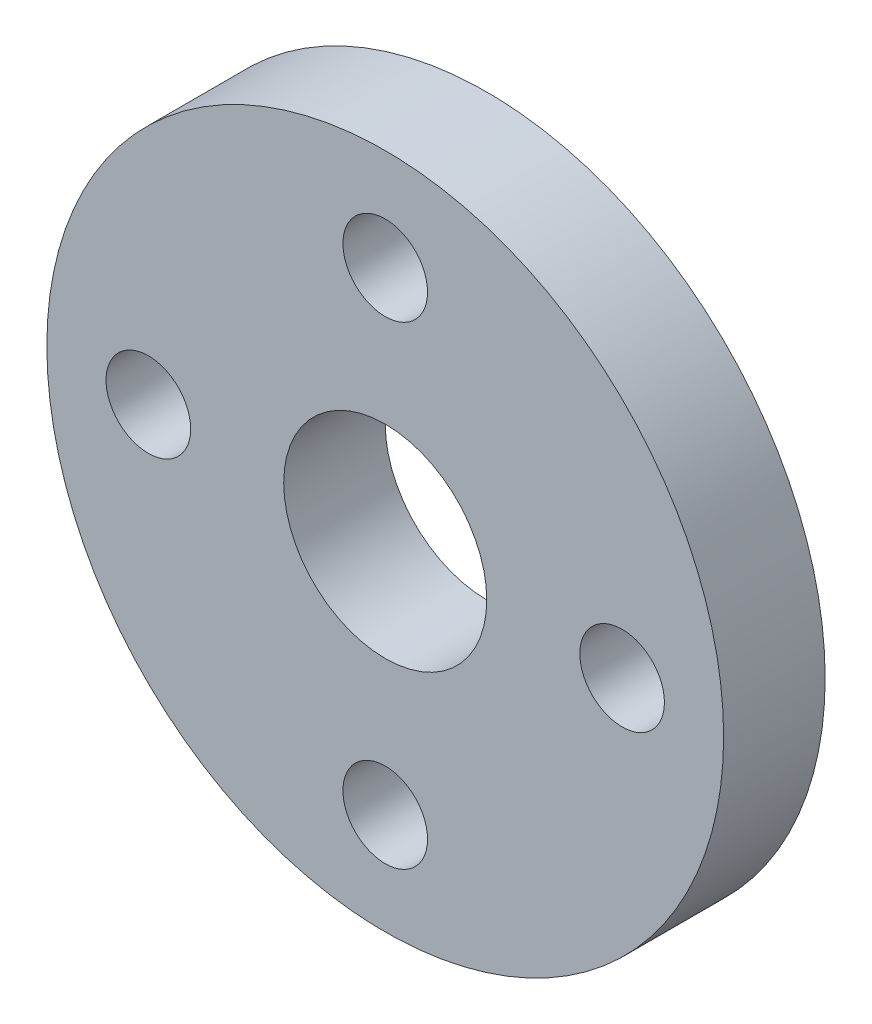
ISO-10303-21;
HEADER;
FILE_DESCRIPTION(('STEP AP214'),'2;1');
FILE_NAME('part.step','',(''),(''),'','','');
FILE_SCHEMA(('AUTOMOTIVE_DESIGN { 1 0 10303 214 1 1 1 1 }'));
ENDSEC;
DATA;
#1=APPLICATION_CONTEXT('core data for automotive mechanical design processes');
#2=APPLICATION_PROTOCOL_DEFINITION('international standard','automotive_design',2000,#1);
#3=PRODUCT_CONTEXT('',#1,'mechanical');
#4=PRODUCT('Part','Part','',(#3));
#5=PRODUCT_RELATED_PRODUCT_CATEGORY('part','',(#4));
#6=PRODUCT_DEFINITION_FORMATION('','',#4);
#7=PRODUCT_DEFINITION_CONTEXT('part definition',#1,'design');
#8=PRODUCT_DEFINITION('design','',#6,#7);
#9=PRODUCT_DEFINITION_SHAPE('','',#8);
#10=(LENGTH_UNIT() NAMED_UNIT(*) SI_UNIT(.MILLI.,.METRE.));
#11=(NAMED_UNIT(*) PLANE_ANGLE_UNIT() SI_UNIT($,.RADIAN.));
#12=(NAMED_UNIT(*) SI_UNIT($,.STERADIAN.) SOLID_ANGLE_UNIT());
#13=UNCERTAINTY_MEASURE_WITH_UNIT(LENGTH_MEASURE(1.E-05),#10,'distance_accuracy_value','');
#14=(GEOMETRIC_REPRESENTATION_CONTEXT(3) GLOBAL_UNCERTAINTY_ASSIGNED_CONTEXT((#13)) GLOBAL_UNIT_ASSIGNED_CONTEXT((#10,
#11,#12)) REPRESENTATION_CONTEXT('',''));
#15=CARTESIAN_POINT('',(0.,0.,0.));
#16=DIRECTION('',(0.,0.,1.));
#17=DIRECTION('',(1.,0.,0.));
#18=AXIS2_PLACEMENT_3D('',#15,#16,#17);
#19=CARTESIAN_POINT('',(0.,0.,3.));
#20=DIRECTION('',(0.,0.,1.));
#21=DIRECTION('',(1.,0.,0.));
#22=AXIS2_PLACEMENT_3D('',#19,#20,#21);
#23=PLANE('',#22);
#24=CARTESIAN_POINT('',(0.,7.,3.));
#25=DIRECTION('',(0.,0.,1.));
#26=DIRECTION('',(1.,0.,0.));
#27=AXIS2_PLACEMENT_3D('',#24,#25,#26);
#28=CIRCLE('',#27,1.24999999999999);
#29=CARTESIAN_POINT('',(1.24999999999999,7.,3.));
#30=VERTEX_POINT('',#29);
#31=EDGE_CURVE('E74',#30,#30,#28,.T.);
#32=ORIENTED_EDGE('',*,*,#31,.F.);
#33=EDGE_LOOP('',(#32));
#34=FACE_BOUND('',#33,.T.);
#35=CARTESIAN_POINT('',(-6.9999999999998,-1.98951966012828E-13,3.));
#36=DIRECTION('',(0.,0.,1.));
#37=DIRECTION('',(1.,0.,0.));
#38=AXIS2_PLACEMENT_3D('',#35,#36,#37);
#39=CIRCLE('',#38,1.24999999999999);
#40=CARTESIAN_POINT('',(-5.74999999999982,-1.98951966012828E-13,3.));
#41=VERTEX_POINT('',#40);
#42=EDGE_CURVE('E68',#41,#41,#39,.T.);
#43=ORIENTED_EDGE('',*,*,#42,.F.);
#44=EDGE_LOOP('',(#43));
#45=FACE_BOUND('',#44,.T.);
#46=CARTESIAN_POINT('',(3.9618942650685E-13,-7.,3.));
#47=DIRECTION('',(0.,0.,1.));
#48=DIRECTION('',(1.,0.,0.));
#49=AXIS2_PLACEMENT_3D('',#46,#47,#48);
#50=CIRCLE('',#49,1.24999999999999);
#51=CARTESIAN_POINT('',(1.25000000000038,-7.,3.));
#52=VERTEX_POINT('',#51);
#53=EDGE_CURVE('E62',#52,#52,#50,.T.);
#54=ORIENTED_EDGE('',*,*,#53,.F.);
#55=EDGE_LOOP('',(#54));
#56=FACE_BOUND('',#55,.T.);
#57=CARTESIAN_POINT('',(7.0000000000002,1.98094713253425E-13,3.));
#58=DIRECTION('',(0.,0.,1.));
#59=DIRECTION('',(1.,0.,0.));
#60=AXIS2_PLACEMENT_3D('',#57,#58,#59);
#61=CIRCLE('',#60,1.24999999999999);
#62=CARTESIAN_POINT('',(8.25000000000018,1.98094713253425E-13,3.));
#63=VERTEX_POINT('',#62);
#64=EDGE_CURVE('E56',#63,#63,#61,.T.);
#65=ORIENTED_EDGE('',*,*,#64,.F.);
#66=EDGE_LOOP('',(#65));
#67=FACE_BOUND('',#66,.T.);
#68=CARTESIAN_POINT('',(0.,0.,3.));
#69=DIRECTION('',(0.,0.,1.));
#70=DIRECTION('',(1.,0.,0.));
#71=AXIS2_PLACEMENT_3D('',#68,#69,#70);
#72=CIRCLE('',#71,10.);
#73=CARTESIAN_POINT('',(10.,0.,3.));
#74=VERTEX_POINT('',#73);
#75=EDGE_CURVE('E10',#74,#74,#72,.T.);
#76=ORIENTED_EDGE('',*,*,#75,.T.);
#77=EDGE_LOOP('',(#76));
#78=FACE_BOUND('',#77,.T.);
#79=CARTESIAN_POINT('',(0.,0.,3.));
#80=DIRECTION('',(0.,0.,1.));
#81=DIRECTION('',(1.,0.,0.));
#82=AXIS2_PLACEMENT_3D('',#79,#80,#81);
#83=CIRCLE('',#82,3.);
#84=CARTESIAN_POINT('',(3.,0.,3.));
#85=VERTEX_POINT('',#84);
#86=EDGE_CURVE('E46',#85,#85,#83,.T.);
#87=ORIENTED_EDGE('',*,*,#86,.F.);
#88=EDGE_LOOP('',(#87));
#89=FACE_BOUND('',#88,.T.);
#90=ADVANCED_FACE('F35',(#34,#45,#56,#67,#78,#89),#23,.T.);
#91=CARTESIAN_POINT('',(0.,0.,0.));
#92=DIRECTION('',(0.,0.,1.));
#93=DIRECTION('',(1.,0.,0.));
#94=AXIS2_PLACEMENT_3D('',#91,#92,#93);
#95=PLANE('',#94);
#96=CARTESIAN_POINT('',(0.,7.,0.));
#97=DIRECTION('',(0.,0.,1.));
#98=DIRECTION('',(1.,0.,0.));
#99=AXIS2_PLACEMENT_3D('',#96,#97,#98);
#100=CIRCLE('',#99,1.25);
#101=CARTESIAN_POINT('',(1.25,7.,0.));
#102=VERTEX_POINT('',#101);
#103=EDGE_CURVE('E71',#102,#102,#100,.T.);
#104=ORIENTED_EDGE('',*,*,#103,.T.);
#105=EDGE_LOOP('',(#104));
#106=FACE_BOUND('',#105,.T.);
#107=CARTESIAN_POINT('',(-6.9999999999998,-1.98951966012828E-13,0.));
#108=DIRECTION('',(0.,0.,1.));
#109=DIRECTION('',(1.,0.,0.));
#110=AXIS2_PLACEMENT_3D('',#107,#108,#109);
#111=CIRCLE('',#110,1.25);
#112=CARTESIAN_POINT('',(-5.7499999999998,-1.98951966012828E-13,0.));
#113=VERTEX_POINT('',#112);
#114=EDGE_CURVE('E65',#113,#113,#111,.T.);
#115=ORIENTED_EDGE('',*,*,#114,.T.);
#116=EDGE_LOOP('',(#115));
#117=FACE_BOUND('',#116,.T.);
#118=CARTESIAN_POINT('',(3.9618942650685E-13,-7.,0.));
#119=DIRECTION('',(0.,0.,1.));
#120=DIRECTION('',(1.,0.,0.));
#121=AXIS2_PLACEMENT_3D('',#118,#119,#120);
#122=CIRCLE('',#121,1.25);
#123=CARTESIAN_POINT('',(1.25000000000039,-7.,0.));
#124=VERTEX_POINT('',#123);
#125=EDGE_CURVE('E59',#124,#124,#122,.T.);
#126=ORIENTED_EDGE('',*,*,#125,.T.);
#127=EDGE_LOOP('',(#126));
#128=FACE_BOUND('',#127,.T.);
#129=CARTESIAN_POINT('',(7.0000000000002,1.98094713253425E-13,0.));
#130=DIRECTION('',(0.,0.,1.));
#131=DIRECTION('',(1.,0.,0.));
#132=AXIS2_PLACEMENT_3D('',#129,#130,#131);
#133=CIRCLE('',#132,1.25);
#134=CARTESIAN_POINT('',(8.2500000000002,1.98094713253425E-13,0.));
#135=VERTEX_POINT('',#134);
#136=EDGE_CURVE('E51',#135,#135,#133,.T.);
#137=ORIENTED_EDGE('',*,*,#136,.T.);
#138=EDGE_LOOP('',(#137));
#139=FACE_BOUND('',#138,.T.);
#140=CARTESIAN_POINT('',(0.,0.,0.));
#141=DIRECTION('',(0.,0.,1.));
#142=DIRECTION('',(1.,0.,0.));
#143=AXIS2_PLACEMENT_3D('',#140,#141,#142);
#144=CIRCLE('',#143,10.);
#145=CARTESIAN_POINT('',(10.,0.,0.));
#146=VERTEX_POINT('',#145);
#147=EDGE_CURVE('E39',#146,#146,#144,.T.);
#148=ORIENTED_EDGE('',*,*,#147,.F.);
#149=EDGE_LOOP('',(#148));
#150=FACE_BOUND('',#149,.T.);
#151=CARTESIAN_POINT('',(0.,0.,0.));
#152=DIRECTION('',(0.,0.,1.));
#153=DIRECTION('',(1.,0.,0.));
#154=AXIS2_PLACEMENT_3D('',#151,#152,#153);
#155=CIRCLE('',#154,3.);
#156=CARTESIAN_POINT('',(3.,0.,0.));
#157=VERTEX_POINT('',#156);
#158=EDGE_CURVE('E48',#157,#157,#155,.T.);
#159=ORIENTED_EDGE('',*,*,#158,.T.);
#160=EDGE_LOOP('',(#159));
#161=FACE_BOUND('',#160,.T.);
#162=ADVANCED_FACE('F82',(#106,#117,#128,#139,#150,#161),#95,.F.);
#163=CARTESIAN_POINT('',(0.,0.,3.));
#164=DIRECTION('',(0.,0.,-1.));
#165=DIRECTION('',(-1.,0.,0.));
#166=AXIS2_PLACEMENT_3D('',#163,#164,#165);
#167=CYLINDRICAL_SURFACE('',#166,10.);
#168=ORIENTED_EDGE('',*,*,#75,.F.);
#169=EDGE_LOOP('',(#168));
#170=FACE_BOUND('',#169,.T.);
#171=ORIENTED_EDGE('',*,*,#147,.T.);
#172=EDGE_LOOP('',(#171));
#173=FACE_BOUND('',#172,.T.);
#174=ADVANCED_FACE('F37',(#170,#173),#167,.T.);
#175=CARTESIAN_POINT('',(0.,0.,3.));
#176=DIRECTION('',(0.,0.,-1.));
#177=DIRECTION('',(-1.,0.,0.));
#178=AXIS2_PLACEMENT_3D('',#175,#176,#177);
#179=CYLINDRICAL_SURFACE('',#178,3.);
#180=ORIENTED_EDGE('',*,*,#86,.T.);
#181=EDGE_LOOP('',(#180));
#182=FACE_BOUND('',#181,.T.);
#183=ORIENTED_EDGE('',*,*,#158,.F.);
#184=EDGE_LOOP('',(#183));
#185=FACE_BOUND('',#184,.T.);
#186=ADVANCED_FACE('F92',(#182,#185),#179,.F.);
#187=CARTESIAN_POINT('',(7.0000000000002,1.98094713253425E-13,3.));
#188=DIRECTION('',(0.,0.,1.));
#189=DIRECTION('',(1.,0.,0.));
#190=AXIS2_PLACEMENT_3D('',#187,#188,#189);
#191=CYLINDRICAL_SURFACE('',#190,1.24999999999999);
#192=ORIENTED_EDGE('',*,*,#136,.F.);
#193=EDGE_LOOP('',(#192));
#194=FACE_BOUND('',#193,.T.);
#195=ORIENTED_EDGE('',*,*,#64,.T.);
#196=EDGE_LOOP('',(#195));
#197=FACE_BOUND('',#196,.T.);
#198=ADVANCED_FACE('F95',(#194,#197),#191,.F.);
#199=CARTESIAN_POINT('',(3.9618942650685E-13,-7.,3.));
#200=DIRECTION('',(0.,0.,1.));
#201=DIRECTION('',(1.,0.,0.));
#202=AXIS2_PLACEMENT_3D('',#199,#200,#201);
#203=CYLINDRICAL_SURFACE('',#202,1.24999999999999);
#204=ORIENTED_EDGE('',*,*,#125,.F.);
#205=EDGE_LOOP('',(#204));
#206=FACE_BOUND('',#205,.T.);
#207=ORIENTED_EDGE('',*,*,#53,.T.);
#208=EDGE_LOOP('',(#207));
#209=FACE_BOUND('',#208,.T.);
#210=ADVANCED_FACE('F109',(#206,#209),#203,.F.);
#211=CARTESIAN_POINT('',(-6.9999999999998,-1.98951966012828E-13,3.));
#212=DIRECTION('',(0.,0.,1.));
#213=DIRECTION('',(1.,0.,0.));
#214=AXIS2_PLACEMENT_3D('',#211,#212,#213);
#215=CYLINDRICAL_SURFACE('',#214,1.24999999999999);
#216=ORIENTED_EDGE('',*,*,#114,.F.);
#217=EDGE_LOOP('',(#216));
#218=FACE_BOUND('',#217,.T.);
#219=ORIENTED_EDGE('',*,*,#42,.T.);
#220=EDGE_LOOP('',(#219));
#221=FACE_BOUND('',#220,.T.);
#222=ADVANCED_FACE('F113',(#218,#221),#215,.F.);
#223=CARTESIAN_POINT('',(0.,7.,3.));
#224=DIRECTION('',(0.,0.,1.));
#225=DIRECTION('',(1.,0.,0.));
#226=AXIS2_PLACEMENT_3D('',#223,#224,#225);
#227=CYLINDRICAL_SURFACE('',#226,1.24999999999999);
#228=ORIENTED_EDGE('',*,*,#103,.F.);
#229=EDGE_LOOP('',(#228));
#230=FACE_BOUND('',#229,.T.);
#231=ORIENTED_EDGE('',*,*,#31,.T.);
#232=EDGE_LOOP('',(#231));
#233=FACE_BOUND('',#232,.T.);
#234=ADVANCED_FACE('F78',(#230,#233),#227,.F.);
#235=CLOSED_SHELL('',(#90,#162,#174,#186,#198,#210,#222,#234));
#236=MANIFOLD_SOLID_BREP('B2',#235);
#237=ADVANCED_BREP_SHAPE_REPRESENTATION('',(#18,#236),#14);
#238=SHAPE_DEFINITION_REPRESENTATION(#9,#237);
ENDSEC;
END-ISO-10303-21;
